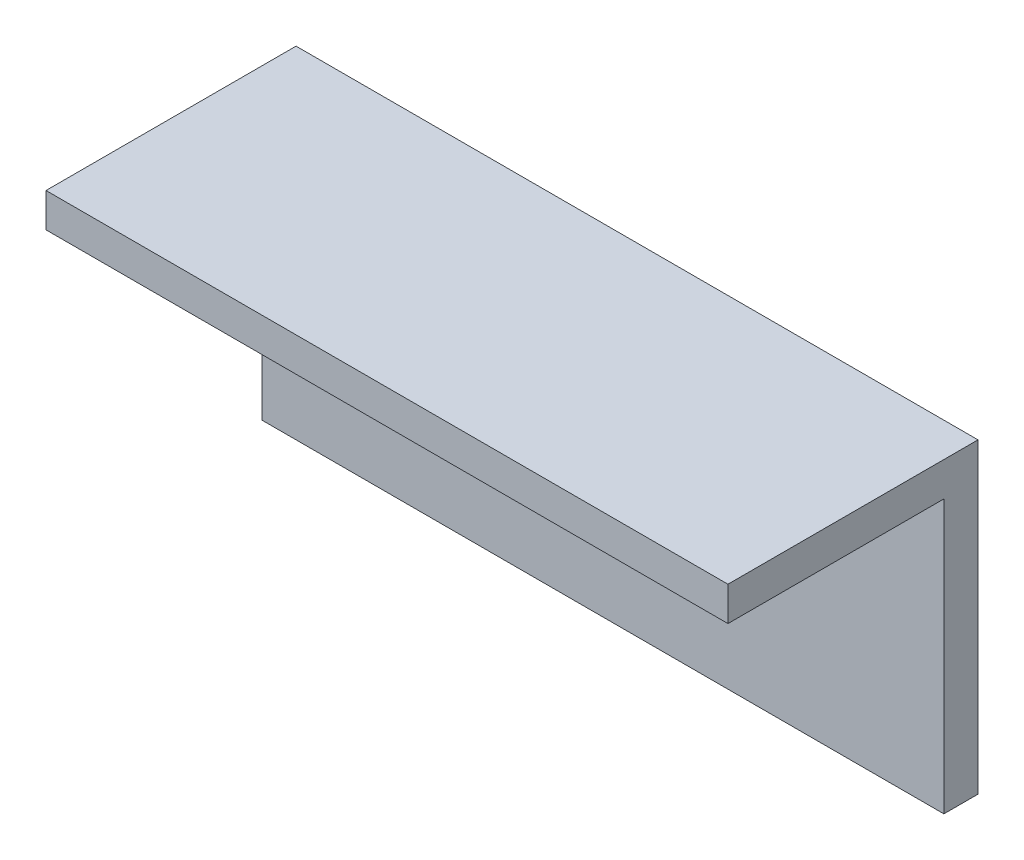
ISO-10303-21;
HEADER;
FILE_DESCRIPTION(('STEP AP214'),'2;1');
FILE_NAME('part.step','',(''),(''),'','','');
FILE_SCHEMA(('AUTOMOTIVE_DESIGN { 1 0 10303 214 1 1 1 1 }'));
ENDSEC;
DATA;
#1=APPLICATION_CONTEXT('core data for automotive mechanical design processes');
#2=APPLICATION_PROTOCOL_DEFINITION('international standard','automotive_design',2000,#1);
#3=PRODUCT_CONTEXT('',#1,'mechanical');
#4=PRODUCT('Part','Part','',(#3));
#5=PRODUCT_RELATED_PRODUCT_CATEGORY('part','',(#4));
#6=PRODUCT_DEFINITION_FORMATION('','',#4);
#7=PRODUCT_DEFINITION_CONTEXT('part definition',#1,'design');
#8=PRODUCT_DEFINITION('design','',#6,#7);
#9=PRODUCT_DEFINITION_SHAPE('','',#8);
#10=(LENGTH_UNIT() NAMED_UNIT(*) SI_UNIT(.MILLI.,.METRE.));
#11=(NAMED_UNIT(*) PLANE_ANGLE_UNIT() SI_UNIT($,.RADIAN.));
#12=(NAMED_UNIT(*) SI_UNIT($,.STERADIAN.) SOLID_ANGLE_UNIT());
#13=UNCERTAINTY_MEASURE_WITH_UNIT(LENGTH_MEASURE(1.E-05),#10,'distance_accuracy_value','');
#14=(GEOMETRIC_REPRESENTATION_CONTEXT(3) GLOBAL_UNCERTAINTY_ASSIGNED_CONTEXT((#13)) GLOBAL_UNIT_ASSIGNED_CONTEXT((#10,
#11,#12)) REPRESENTATION_CONTEXT('',''));
#15=CARTESIAN_POINT('',(0.,0.,0.));
#16=DIRECTION('',(0.,0.,1.));
#17=DIRECTION('',(1.,0.,0.));
#18=AXIS2_PLACEMENT_3D('',#15,#16,#17);
#19=CARTESIAN_POINT('',(30.,13.5,3.));
#20=DIRECTION('',(-1.,0.,0.));
#21=DIRECTION('',(0.,0.,1.));
#22=AXIS2_PLACEMENT_3D('',#19,#20,#21);
#23=PLANE('',#22);
#24=DIRECTION('',(0.,1.,0.));
#25=VECTOR('',#24,1.);
#26=CARTESIAN_POINT('',(30.,13.5,0.));
#27=LINE('',#26,#25);
#28=CARTESIAN_POINT('',(30.,-13.5,0.));
#29=VERTEX_POINT('',#28);
#30=CARTESIAN_POINT('',(30.,13.5,0.));
#31=VERTEX_POINT('',#30);
#32=EDGE_CURVE('E100',#29,#31,#27,.T.);
#33=ORIENTED_EDGE('',*,*,#32,.T.);
#34=DIRECTION('',(0.,0.,-1.));
#35=VECTOR('',#34,1.);
#36=CARTESIAN_POINT('',(30.,13.5,3.));
#37=LINE('',#36,#35);
#38=CARTESIAN_POINT('',(30.,13.5,22.));
#39=VERTEX_POINT('',#38);
#40=EDGE_CURVE('E11',#39,#31,#37,.T.);
#41=ORIENTED_EDGE('',*,*,#40,.F.);
#42=DIRECTION('',(0.,1.,0.));
#43=VECTOR('',#42,1.);
#44=CARTESIAN_POINT('',(30.,13.5,22.));
#45=LINE('',#44,#43);
#46=CARTESIAN_POINT('',(30.,10.5,22.));
#47=VERTEX_POINT('',#46);
#48=EDGE_CURVE('E143',#47,#39,#45,.T.);
#49=ORIENTED_EDGE('',*,*,#48,.F.);
#50=DIRECTION('',(0.,0.,-1.));
#51=VECTOR('',#50,1.);
#52=CARTESIAN_POINT('',(30.,10.5,22.));
#53=LINE('',#52,#51);
#54=CARTESIAN_POINT('',(30.,10.5,3.));
#55=VERTEX_POINT('',#54);
#56=EDGE_CURVE('E113',#47,#55,#53,.T.);
#57=ORIENTED_EDGE('',*,*,#56,.T.);
#58=DIRECTION('',(0.,1.,0.));
#59=VECTOR('',#58,1.);
#60=CARTESIAN_POINT('',(30.,13.5,3.));
#61=LINE('',#60,#59);
#62=CARTESIAN_POINT('',(30.,-13.5,3.));
#63=VERTEX_POINT('',#62);
#64=EDGE_CURVE('E94',#63,#55,#61,.T.);
#65=ORIENTED_EDGE('',*,*,#64,.F.);
#66=DIRECTION('',(0.,0.,-1.));
#67=VECTOR('',#66,1.);
#68=CARTESIAN_POINT('',(30.,-13.5,3.));
#69=LINE('',#68,#67);
#70=EDGE_CURVE('E86',#63,#29,#69,.T.);
#71=ORIENTED_EDGE('',*,*,#70,.T.);
#72=EDGE_LOOP('',(#33,#41,#49,#57,#65,#71));
#73=FACE_BOUND('',#72,.T.);
#74=ADVANCED_FACE('F43',(#73),#23,.F.);
#75=CARTESIAN_POINT('',(-30.,13.5,3.));
#76=DIRECTION('',(0.,-1.,0.));
#77=DIRECTION('',(0.,0.,-1.));
#78=AXIS2_PLACEMENT_3D('',#75,#76,#77);
#79=PLANE('',#78);
#80=DIRECTION('',(-1.,0.,0.));
#81=VECTOR('',#80,1.);
#82=CARTESIAN_POINT('',(-30.,13.5,0.));
#83=LINE('',#82,#81);
#84=CARTESIAN_POINT('',(-30.,13.5,0.));
#85=VERTEX_POINT('',#84);
#86=EDGE_CURVE('E105',#31,#85,#83,.T.);
#87=ORIENTED_EDGE('',*,*,#86,.T.);
#88=DIRECTION('',(0.,0.,-1.));
#89=VECTOR('',#88,1.);
#90=CARTESIAN_POINT('',(-30.,13.5,3.));
#91=LINE('',#90,#89);
#92=CARTESIAN_POINT('',(-30.,13.5,22.));
#93=VERTEX_POINT('',#92);
#94=EDGE_CURVE('E51',#93,#85,#91,.T.);
#95=ORIENTED_EDGE('',*,*,#94,.F.);
#96=DIRECTION('',(-1.,0.,0.));
#97=VECTOR('',#96,1.);
#98=CARTESIAN_POINT('',(-30.,13.5,22.));
#99=LINE('',#98,#97);
#100=EDGE_CURVE('E135',#39,#93,#99,.T.);
#101=ORIENTED_EDGE('',*,*,#100,.F.);
#102=ORIENTED_EDGE('',*,*,#40,.T.);
#103=EDGE_LOOP('',(#87,#95,#101,#102));
#104=FACE_BOUND('',#103,.T.);
#105=ADVANCED_FACE('F133',(#104),#79,.F.);
#106=CARTESIAN_POINT('',(-30.,13.5,3.));
#107=DIRECTION('',(1.,0.,0.));
#108=DIRECTION('',(0.,1.,0.));
#109=AXIS2_PLACEMENT_3D('',#106,#107,#108);
#110=PLANE('',#109);
#111=DIRECTION('',(0.,-1.,0.));
#112=VECTOR('',#111,1.);
#113=CARTESIAN_POINT('',(-30.,13.5,0.));
#114=LINE('',#113,#112);
#115=CARTESIAN_POINT('',(-30.,-13.5,0.));
#116=VERTEX_POINT('',#115);
#117=EDGE_CURVE('E95',#85,#116,#114,.T.);
#118=ORIENTED_EDGE('',*,*,#117,.T.);
#119=DIRECTION('',(0.,0.,-1.));
#120=VECTOR('',#119,1.);
#121=CARTESIAN_POINT('',(-30.,-13.5,3.));
#122=LINE('',#121,#120);
#123=CARTESIAN_POINT('',(-30.,-13.5,3.));
#124=VERTEX_POINT('',#123);
#125=EDGE_CURVE('E89',#124,#116,#122,.T.);
#126=ORIENTED_EDGE('',*,*,#125,.F.);
#127=DIRECTION('',(0.,-1.,0.));
#128=VECTOR('',#127,1.);
#129=CARTESIAN_POINT('',(-30.,13.5,3.));
#130=LINE('',#129,#128);
#131=CARTESIAN_POINT('',(-30.,10.5,3.));
#132=VERTEX_POINT('',#131);
#133=EDGE_CURVE('E156',#132,#124,#130,.T.);
#134=ORIENTED_EDGE('',*,*,#133,.F.);
#135=DIRECTION('',(0.,0.,-1.));
#136=VECTOR('',#135,1.);
#137=CARTESIAN_POINT('',(-30.,10.5,22.));
#138=LINE('',#137,#136);
#139=CARTESIAN_POINT('',(-30.,10.5,22.));
#140=VERTEX_POINT('',#139);
#141=EDGE_CURVE('E107',#140,#132,#138,.T.);
#142=ORIENTED_EDGE('',*,*,#141,.F.);
#143=DIRECTION('',(0.,-1.,0.));
#144=VECTOR('',#143,1.);
#145=CARTESIAN_POINT('',(-30.,13.5,22.));
#146=LINE('',#145,#144);
#147=EDGE_CURVE('E129',#93,#140,#146,.T.);
#148=ORIENTED_EDGE('',*,*,#147,.F.);
#149=ORIENTED_EDGE('',*,*,#94,.T.);
#150=EDGE_LOOP('',(#118,#126,#134,#142,#148,#149));
#151=FACE_BOUND('',#150,.T.);
#152=ADVANCED_FACE('F126',(#151),#110,.F.);
#153=CARTESIAN_POINT('',(-30.,-13.5,3.));
#154=DIRECTION('',(0.,1.,0.));
#155=DIRECTION('',(0.,0.,1.));
#156=AXIS2_PLACEMENT_3D('',#153,#154,#155);
#157=PLANE('',#156);
#158=DIRECTION('',(1.,0.,0.));
#159=VECTOR('',#158,1.);
#160=CARTESIAN_POINT('',(-30.,-13.5,0.));
#161=LINE('',#160,#159);
#162=EDGE_CURVE('E83',#116,#29,#161,.T.);
#163=ORIENTED_EDGE('',*,*,#162,.T.);
#164=ORIENTED_EDGE('',*,*,#70,.F.);
#165=DIRECTION('',(1.,0.,0.));
#166=VECTOR('',#165,1.);
#167=CARTESIAN_POINT('',(-30.,-13.5,3.));
#168=LINE('',#167,#166);
#169=EDGE_CURVE('E64',#124,#63,#168,.T.);
#170=ORIENTED_EDGE('',*,*,#169,.F.);
#171=ORIENTED_EDGE('',*,*,#125,.T.);
#172=EDGE_LOOP('',(#163,#164,#170,#171));
#173=FACE_BOUND('',#172,.T.);
#174=ADVANCED_FACE('F85',(#173),#157,.F.);
#175=CARTESIAN_POINT('',(0.,0.,3.));
#176=DIRECTION('',(0.,0.,1.));
#177=DIRECTION('',(1.,0.,0.));
#178=AXIS2_PLACEMENT_3D('',#175,#176,#177);
#179=PLANE('',#178);
#180=DIRECTION('',(1.,0.,0.));
#181=VECTOR('',#180,1.);
#182=CARTESIAN_POINT('',(-30.,10.5,3.));
#183=LINE('',#182,#181);
#184=EDGE_CURVE('E58',#132,#55,#183,.T.);
#185=ORIENTED_EDGE('',*,*,#184,.F.);
#186=ORIENTED_EDGE('',*,*,#133,.T.);
#187=ORIENTED_EDGE('',*,*,#169,.T.);
#188=ORIENTED_EDGE('',*,*,#64,.T.);
#189=EDGE_LOOP('',(#185,#186,#187,#188));
#190=FACE_BOUND('',#189,.T.);
#191=ADVANCED_FACE('F159',(#190),#179,.T.);
#192=CARTESIAN_POINT('',(0.,0.,0.));
#193=DIRECTION('',(0.,0.,1.));
#194=DIRECTION('',(1.,0.,0.));
#195=AXIS2_PLACEMENT_3D('',#192,#193,#194);
#196=PLANE('',#195);
#197=ORIENTED_EDGE('',*,*,#32,.F.);
#198=ORIENTED_EDGE('',*,*,#162,.F.);
#199=ORIENTED_EDGE('',*,*,#117,.F.);
#200=ORIENTED_EDGE('',*,*,#86,.F.);
#201=EDGE_LOOP('',(#197,#198,#199,#200));
#202=FACE_BOUND('',#201,.T.);
#203=ADVANCED_FACE('F104',(#202),#196,.F.);
#204=CARTESIAN_POINT('',(-30.,10.5,22.));
#205=DIRECTION('',(0.,1.,0.));
#206=DIRECTION('',(0.,0.,1.));
#207=AXIS2_PLACEMENT_3D('',#204,#205,#206);
#208=PLANE('',#207);
#209=ORIENTED_EDGE('',*,*,#184,.T.);
#210=ORIENTED_EDGE('',*,*,#56,.F.);
#211=DIRECTION('',(1.,0.,0.));
#212=VECTOR('',#211,1.);
#213=CARTESIAN_POINT('',(-30.,10.5,22.));
#214=LINE('',#213,#212);
#215=EDGE_CURVE('E149',#140,#47,#214,.T.);
#216=ORIENTED_EDGE('',*,*,#215,.F.);
#217=ORIENTED_EDGE('',*,*,#141,.T.);
#218=EDGE_LOOP('',(#209,#210,#216,#217));
#219=FACE_BOUND('',#218,.T.);
#220=ADVANCED_FACE('F162',(#219),#208,.F.);
#221=CARTESIAN_POINT('',(0.,0.,22.));
#222=DIRECTION('',(0.,0.,1.));
#223=DIRECTION('',(1.,0.,0.));
#224=AXIS2_PLACEMENT_3D('',#221,#222,#223);
#225=PLANE('',#224);
#226=ORIENTED_EDGE('',*,*,#147,.T.);
#227=ORIENTED_EDGE('',*,*,#215,.T.);
#228=ORIENTED_EDGE('',*,*,#48,.T.);
#229=ORIENTED_EDGE('',*,*,#100,.T.);
#230=EDGE_LOOP('',(#226,#227,#228,#229));
#231=FACE_BOUND('',#230,.T.);
#232=ADVANCED_FACE('F139',(#231),#225,.T.);
#233=CLOSED_SHELL('',(#74,#105,#152,#174,#191,#203,#220,#232));
#234=MANIFOLD_SOLID_BREP('B2',#233);
#235=ADVANCED_BREP_SHAPE_REPRESENTATION('',(#18,#234),#14);
#236=SHAPE_DEFINITION_REPRESENTATION(#9,#235);
ENDSEC;
END-ISO-10303-21;
